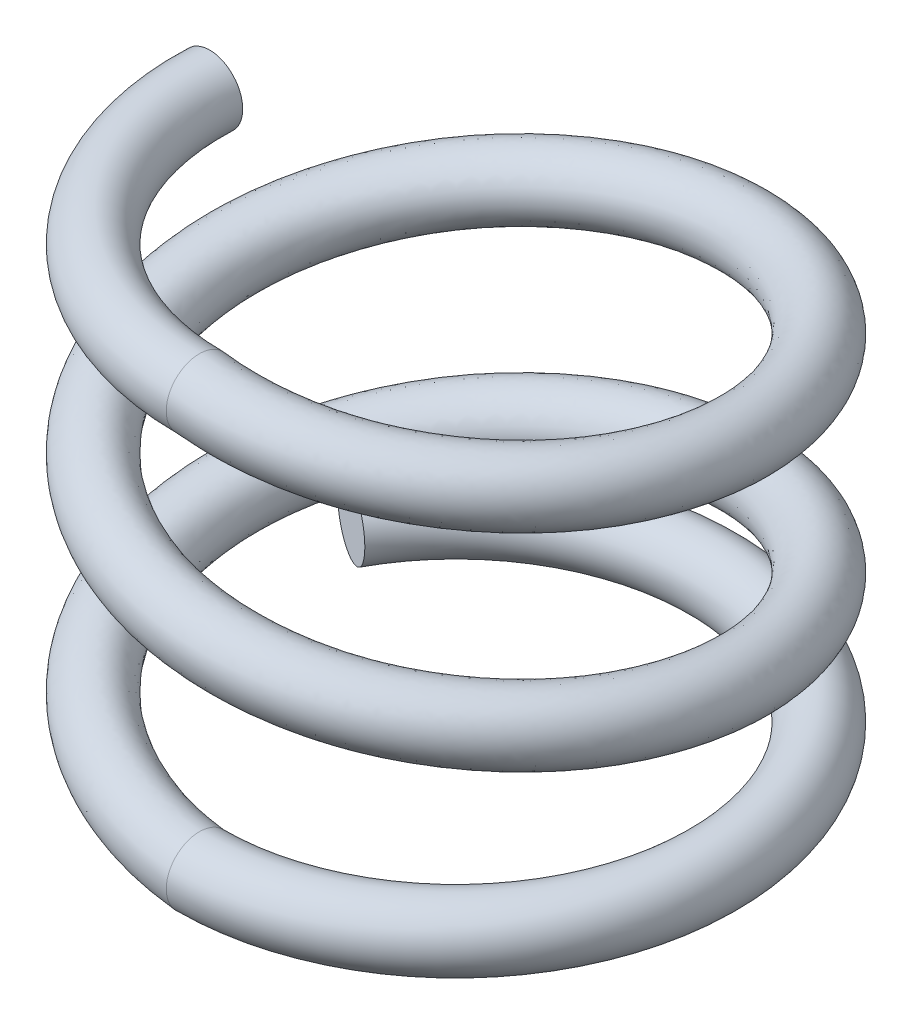
ISO-10303-21;
HEADER;
FILE_DESCRIPTION(('STEP AP214'),'2;1');
FILE_NAME('part.step','',(''),(''),'','','');
FILE_SCHEMA(('AUTOMOTIVE_DESIGN { 1 0 10303 214 1 1 1 1 }'));
ENDSEC;
DATA;
#1=APPLICATION_CONTEXT('core data for automotive mechanical design processes');
#2=APPLICATION_PROTOCOL_DEFINITION('international standard','automotive_design',2000,#1);
#3=PRODUCT_CONTEXT('',#1,'mechanical');
#4=PRODUCT('Part','Part','',(#3));
#5=PRODUCT_RELATED_PRODUCT_CATEGORY('part','',(#4));
#6=PRODUCT_DEFINITION_FORMATION('','',#4);
#7=PRODUCT_DEFINITION_CONTEXT('part definition',#1,'design');
#8=PRODUCT_DEFINITION('design','',#6,#7);
#9=PRODUCT_DEFINITION_SHAPE('','',#8);
#10=(LENGTH_UNIT() NAMED_UNIT(*) SI_UNIT(.MILLI.,.METRE.));
#11=(NAMED_UNIT(*) PLANE_ANGLE_UNIT() SI_UNIT($,.RADIAN.));
#12=(NAMED_UNIT(*) SI_UNIT($,.STERADIAN.) SOLID_ANGLE_UNIT());
#13=UNCERTAINTY_MEASURE_WITH_UNIT(LENGTH_MEASURE(1.E-05),#10,'distance_accuracy_value','');
#14=(GEOMETRIC_REPRESENTATION_CONTEXT(3) GLOBAL_UNCERTAINTY_ASSIGNED_CONTEXT((#13)) GLOBAL_UNIT_ASSIGNED_CONTEXT((#10,
#11,#12)) REPRESENTATION_CONTEXT('',''));
#15=CARTESIAN_POINT('',(0.,0.,0.));
#16=DIRECTION('',(0.,0.,1.));
#17=DIRECTION('',(1.,0.,0.));
#18=AXIS2_PLACEMENT_3D('',#15,#16,#17);
#19=CARTESIAN_POINT('',(0.,0.,2.7));
#20=CARTESIAN_POINT('',(-0.877283179828847,0.125,2.7));
#21=CARTESIAN_POINT('',(-1.58702018118968,0.25,2.18434588481236));
#22=CARTESIAN_POINT('',(-2.29675718255051,0.375,1.66869176962472));
#23=CARTESIAN_POINT('',(-2.56785259399691,0.5,0.834345884812358));
#24=CARTESIAN_POINT('',(-2.83894800544332,0.625,0.));
#25=CARTESIAN_POINT('',(-2.56785259399691,0.75,-0.834345884812358));
#26=CARTESIAN_POINT('',(-2.29675718255051,0.875,-1.66869176962472));
#27=CARTESIAN_POINT('',(-1.58702018118968,1.,-2.18434588481236));
#28=CARTESIAN_POINT('',(-0.877283179828847,1.125,-2.7));
#29=CARTESIAN_POINT('',(0.,1.25,-2.7));
#30=CARTESIAN_POINT('',(0.877283179828847,1.375,-2.7));
#31=CARTESIAN_POINT('',(1.58702018118968,1.5,-2.18434588481236));
#32=CARTESIAN_POINT('',(2.29675718255051,1.625,-1.66869176962472));
#33=CARTESIAN_POINT('',(2.56785259399691,1.75,-0.834345884812358));
#34=CARTESIAN_POINT('',(2.83894800544332,1.875,0.));
#35=CARTESIAN_POINT('',(2.56785259399691,2.,0.834345884812357));
#36=CARTESIAN_POINT('',(2.29675718255051,2.125,1.66869176962472));
#37=CARTESIAN_POINT('',(1.58702018118968,2.25,2.18434588481236));
#38=CARTESIAN_POINT('',(0.877283179828848,2.375,2.7));
#39=CARTESIAN_POINT('',(0.,2.5,2.7));
#40=CARTESIAN_POINT('',(-0.877283179828847,2.625,2.7));
#41=CARTESIAN_POINT('',(-1.58702018118968,2.75,2.18434588481236));
#42=CARTESIAN_POINT('',(-2.29675718255051,2.875,1.66869176962472));
#43=CARTESIAN_POINT('',(-2.56785259399691,3.,0.834345884812358));
#44=CARTESIAN_POINT('',(-2.83894800544332,3.125,0.));
#45=CARTESIAN_POINT('',(-2.56785259399691,3.25,-0.834345884812358));
#46=CARTESIAN_POINT('',(-2.29675718255051,3.375,-1.66869176962472));
#47=CARTESIAN_POINT('',(-1.58702018118968,3.5,-2.18434588481236));
#48=CARTESIAN_POINT('',(-0.877283179828847,3.625,-2.7));
#49=CARTESIAN_POINT('',(0.,3.75,-2.7));
#50=CARTESIAN_POINT('',(0.877283179828847,3.875,-2.7));
#51=CARTESIAN_POINT('',(1.58702018118968,4.,-2.18434588481236));
#52=CARTESIAN_POINT('',(2.29675718255051,4.125,-1.66869176962472));
#53=CARTESIAN_POINT('',(2.56785259399691,4.25,-0.834345884812358));
#54=CARTESIAN_POINT('',(2.83894800544332,4.375,0.));
#55=CARTESIAN_POINT('',(2.56785259399691,4.5,0.834345884812357));
#56=CARTESIAN_POINT('',(2.29675718255051,4.625,1.66869176962472));
#57=CARTESIAN_POINT('',(1.58702018118968,4.75,2.18434588481236));
#58=CARTESIAN_POINT('',(0.877283179828848,4.875,2.7));
#59=CARTESIAN_POINT('',(0.,5.,2.7));
#60=CARTESIAN_POINT('',(0.,0.800000000000001,2.7));
#61=CARTESIAN_POINT('',(-0.877283179828847,0.925000000000001,2.7));
#62=CARTESIAN_POINT('',(-1.58702018118968,1.05,2.18434588481236));
#63=CARTESIAN_POINT('',(-2.29675718255051,1.175,1.66869176962472));
#64=CARTESIAN_POINT('',(-2.56785259399691,1.3,0.834345884812358));
#65=CARTESIAN_POINT('',(-2.83894800544332,1.425,0.));
#66=CARTESIAN_POINT('',(-2.56785259399691,1.55,-0.834345884812358));
#67=CARTESIAN_POINT('',(-2.29675718255051,1.675,-1.66869176962472));
#68=CARTESIAN_POINT('',(-1.58702018118968,1.8,-2.18434588481236));
#69=CARTESIAN_POINT('',(-0.877283179828847,1.925,-2.7));
#70=CARTESIAN_POINT('',(0.,2.05,-2.7));
#71=CARTESIAN_POINT('',(0.877283179828847,2.175,-2.7));
#72=CARTESIAN_POINT('',(1.58702018118968,2.3,-2.18434588481236));
#73=CARTESIAN_POINT('',(2.29675718255051,2.425,-1.66869176962472));
#74=CARTESIAN_POINT('',(2.56785259399691,2.55,-0.834345884812358));
#75=CARTESIAN_POINT('',(2.83894800544332,2.675,0.));
#76=CARTESIAN_POINT('',(2.56785259399691,2.8,0.834345884812357));
#77=CARTESIAN_POINT('',(2.29675718255051,2.925,1.66869176962472));
#78=CARTESIAN_POINT('',(1.58702018118968,3.05,2.18434588481236));
#79=CARTESIAN_POINT('',(0.877283179828848,3.175,2.7));
#80=CARTESIAN_POINT('',(0.,3.3,2.7));
#81=CARTESIAN_POINT('',(-0.877283179828847,3.425,2.7));
#82=CARTESIAN_POINT('',(-1.58702018118968,3.55,2.18434588481236));
#83=CARTESIAN_POINT('',(-2.29675718255051,3.675,1.66869176962472));
#84=CARTESIAN_POINT('',(-2.56785259399691,3.8,0.834345884812358));
#85=CARTESIAN_POINT('',(-2.83894800544332,3.925,0.));
#86=CARTESIAN_POINT('',(-2.56785259399691,4.05,-0.834345884812358));
#87=CARTESIAN_POINT('',(-2.29675718255051,4.175,-1.66869176962472));
#88=CARTESIAN_POINT('',(-1.58702018118968,4.3,-2.18434588481236));
#89=CARTESIAN_POINT('',(-0.877283179828847,4.425,-2.7));
#90=CARTESIAN_POINT('',(0.,4.55,-2.7));
#91=CARTESIAN_POINT('',(0.877283179828847,4.675,-2.7));
#92=CARTESIAN_POINT('',(1.58702018118968,4.8,-2.18434588481236));
#93=CARTESIAN_POINT('',(2.29675718255051,4.925,-1.66869176962472));
#94=CARTESIAN_POINT('',(2.56785259399691,5.05,-0.834345884812358));
#95=CARTESIAN_POINT('',(2.83894800544332,5.175,0.));
#96=CARTESIAN_POINT('',(2.56785259399691,5.3,0.834345884812357));
#97=CARTESIAN_POINT('',(2.29675718255051,5.425,1.66869176962472));
#98=CARTESIAN_POINT('',(1.58702018118968,5.55,2.18434588481236));
#99=CARTESIAN_POINT('',(0.877283179828848,5.675,2.7));
#100=CARTESIAN_POINT('',(0.,5.8,2.7));
#101=CARTESIAN_POINT('',(0.,0.800000000000001,3.5));
#102=CARTESIAN_POINT('',(-1.13721893681517,0.925000000000001,3.5));
#103=CARTESIAN_POINT('',(-2.05724838302366,1.05,2.83155948031232));
#104=CARTESIAN_POINT('',(-2.97727782923214,1.175,2.16311896062463));
#105=CARTESIAN_POINT('',(-3.32869780703304,1.3,1.08155948031232));
#106=CARTESIAN_POINT('',(-3.68011778483394,1.425,0.));
#107=CARTESIAN_POINT('',(-3.32869780703304,1.55,-1.08155948031232));
#108=CARTESIAN_POINT('',(-2.97727782923214,1.675,-2.16311896062463));
#109=CARTESIAN_POINT('',(-2.05724838302366,1.8,-2.83155948031232));
#110=CARTESIAN_POINT('',(-1.13721893681517,1.925,-3.5));
#111=CARTESIAN_POINT('',(0.,2.05,-3.5));
#112=CARTESIAN_POINT('',(1.13721893681517,2.175,-3.5));
#113=CARTESIAN_POINT('',(2.05724838302366,2.3,-2.83155948031232));
#114=CARTESIAN_POINT('',(2.97727782923214,2.425,-2.16311896062463));
#115=CARTESIAN_POINT('',(3.32869780703304,2.55,-1.08155948031232));
#116=CARTESIAN_POINT('',(3.68011778483394,2.675,0.));
#117=CARTESIAN_POINT('',(3.32869780703304,2.8,1.08155948031232));
#118=CARTESIAN_POINT('',(2.97727782923214,2.925,2.16311896062463));
#119=CARTESIAN_POINT('',(2.05724838302366,3.05,2.83155948031232));
#120=CARTESIAN_POINT('',(1.13721893681517,3.175,3.5));
#121=CARTESIAN_POINT('',(0.,3.3,3.5));
#122=CARTESIAN_POINT('',(-1.13721893681517,3.425,3.5));
#123=CARTESIAN_POINT('',(-2.05724838302366,3.55,2.83155948031232));
#124=CARTESIAN_POINT('',(-2.97727782923214,3.675,2.16311896062463));
#125=CARTESIAN_POINT('',(-3.32869780703304,3.8,1.08155948031232));
#126=CARTESIAN_POINT('',(-3.68011778483394,3.925,0.));
#127=CARTESIAN_POINT('',(-3.32869780703304,4.05,-1.08155948031232));
#128=CARTESIAN_POINT('',(-2.97727782923214,4.175,-2.16311896062463));
#129=CARTESIAN_POINT('',(-2.05724838302366,4.3,-2.83155948031232));
#130=CARTESIAN_POINT('',(-1.13721893681517,4.425,-3.5));
#131=CARTESIAN_POINT('',(0.,4.55,-3.5));
#132=CARTESIAN_POINT('',(1.13721893681517,4.675,-3.5));
#133=CARTESIAN_POINT('',(2.05724838302366,4.8,-2.83155948031232));
#134=CARTESIAN_POINT('',(2.97727782923214,4.925,-2.16311896062463));
#135=CARTESIAN_POINT('',(3.32869780703304,5.05,-1.08155948031232));
#136=CARTESIAN_POINT('',(3.68011778483394,5.175,0.));
#137=CARTESIAN_POINT('',(3.32869780703304,5.3,1.08155948031232));
#138=CARTESIAN_POINT('',(2.97727782923214,5.425,2.16311896062463));
#139=CARTESIAN_POINT('',(2.05724838302366,5.55,2.83155948031232));
#140=CARTESIAN_POINT('',(1.13721893681517,5.675,3.5));
#141=CARTESIAN_POINT('',(0.,5.8,3.5));
#142=CARTESIAN_POINT('',(0.,0.,3.5));
#143=CARTESIAN_POINT('',(-1.13721893681517,0.125,3.5));
#144=CARTESIAN_POINT('',(-2.05724838302366,0.25,2.83155948031232));
#145=CARTESIAN_POINT('',(-2.97727782923214,0.375,2.16311896062463));
#146=CARTESIAN_POINT('',(-3.32869780703304,0.5,1.08155948031232));
#147=CARTESIAN_POINT('',(-3.68011778483394,0.625,0.));
#148=CARTESIAN_POINT('',(-3.32869780703304,0.75,-1.08155948031232));
#149=CARTESIAN_POINT('',(-2.97727782923214,0.875,-2.16311896062463));
#150=CARTESIAN_POINT('',(-2.05724838302366,1.,-2.83155948031232));
#151=CARTESIAN_POINT('',(-1.13721893681517,1.125,-3.5));
#152=CARTESIAN_POINT('',(0.,1.25,-3.5));
#153=CARTESIAN_POINT('',(1.13721893681517,1.375,-3.5));
#154=CARTESIAN_POINT('',(2.05724838302366,1.5,-2.83155948031232));
#155=CARTESIAN_POINT('',(2.97727782923214,1.625,-2.16311896062463));
#156=CARTESIAN_POINT('',(3.32869780703304,1.75,-1.08155948031232));
#157=CARTESIAN_POINT('',(3.68011778483394,1.875,0.));
#158=CARTESIAN_POINT('',(3.32869780703304,2.,1.08155948031232));
#159=CARTESIAN_POINT('',(2.97727782923214,2.125,2.16311896062463));
#160=CARTESIAN_POINT('',(2.05724838302366,2.25,2.83155948031232));
#161=CARTESIAN_POINT('',(1.13721893681517,2.375,3.5));
#162=CARTESIAN_POINT('',(0.,2.5,3.5));
#163=CARTESIAN_POINT('',(-1.13721893681517,2.625,3.5));
#164=CARTESIAN_POINT('',(-2.05724838302366,2.75,2.83155948031232));
#165=CARTESIAN_POINT('',(-2.97727782923214,2.875,2.16311896062463));
#166=CARTESIAN_POINT('',(-3.32869780703304,3.,1.08155948031232));
#167=CARTESIAN_POINT('',(-3.68011778483394,3.125,0.));
#168=CARTESIAN_POINT('',(-3.32869780703304,3.25,-1.08155948031232));
#169=CARTESIAN_POINT('',(-2.97727782923214,3.375,-2.16311896062463));
#170=CARTESIAN_POINT('',(-2.05724838302366,3.5,-2.83155948031232));
#171=CARTESIAN_POINT('',(-1.13721893681517,3.625,-3.5));
#172=CARTESIAN_POINT('',(0.,3.75,-3.5));
#173=CARTESIAN_POINT('',(1.13721893681517,3.875,-3.5));
#174=CARTESIAN_POINT('',(2.05724838302366,4.,-2.83155948031232));
#175=CARTESIAN_POINT('',(2.97727782923214,4.125,-2.16311896062463));
#176=CARTESIAN_POINT('',(3.32869780703304,4.25,-1.08155948031232));
#177=CARTESIAN_POINT('',(3.68011778483394,4.375,0.));
#178=CARTESIAN_POINT('',(3.32869780703304,4.5,1.08155948031232));
#179=CARTESIAN_POINT('',(2.97727782923214,4.625,2.16311896062463));
#180=CARTESIAN_POINT('',(2.05724838302366,4.75,2.83155948031232));
#181=CARTESIAN_POINT('',(1.13721893681517,4.875,3.5));
#182=CARTESIAN_POINT('',(0.,5.,3.5));
#183=CARTESIAN_POINT('',(0.,-0.800000000000001,3.5));
#184=CARTESIAN_POINT('',(-1.13721893681517,-0.675000000000001,3.5));
#185=CARTESIAN_POINT('',(-2.05724838302366,-0.550000000000001,2.83155948031232));
#186=CARTESIAN_POINT('',(-2.97727782923214,-0.425000000000001,2.16311896062463));
#187=CARTESIAN_POINT('',(-3.32869780703304,-0.300000000000001,1.08155948031232));
#188=CARTESIAN_POINT('',(-3.68011778483394,-0.175000000000001,0.));
#189=CARTESIAN_POINT('',(-3.32869780703304,-0.0500000000000008,-1.08155948031232));
#190=CARTESIAN_POINT('',(-2.97727782923214,0.0749999999999992,-2.16311896062463));
#191=CARTESIAN_POINT('',(-2.05724838302366,0.199999999999999,-2.83155948031232));
#192=CARTESIAN_POINT('',(-1.13721893681517,0.324999999999999,-3.5));
#193=CARTESIAN_POINT('',(0.,0.449999999999999,-3.5));
#194=CARTESIAN_POINT('',(1.13721893681517,0.574999999999999,-3.5));
#195=CARTESIAN_POINT('',(2.05724838302366,0.699999999999999,-2.83155948031232));
#196=CARTESIAN_POINT('',(2.97727782923214,0.824999999999999,-2.16311896062463));
#197=CARTESIAN_POINT('',(3.32869780703304,0.949999999999999,-1.08155948031232));
#198=CARTESIAN_POINT('',(3.68011778483394,1.075,0.));
#199=CARTESIAN_POINT('',(3.32869780703304,1.2,1.08155948031232));
#200=CARTESIAN_POINT('',(2.97727782923214,1.325,2.16311896062463));
#201=CARTESIAN_POINT('',(2.05724838302366,1.45,2.83155948031232));
#202=CARTESIAN_POINT('',(1.13721893681517,1.575,3.5));
#203=CARTESIAN_POINT('',(0.,1.7,3.5));
#204=CARTESIAN_POINT('',(-1.13721893681517,1.825,3.5));
#205=CARTESIAN_POINT('',(-2.05724838302366,1.95,2.83155948031232));
#206=CARTESIAN_POINT('',(-2.97727782923214,2.075,2.16311896062463));
#207=CARTESIAN_POINT('',(-3.32869780703304,2.2,1.08155948031232));
#208=CARTESIAN_POINT('',(-3.68011778483394,2.325,0.));
#209=CARTESIAN_POINT('',(-3.32869780703304,2.45,-1.08155948031232));
#210=CARTESIAN_POINT('',(-2.97727782923214,2.575,-2.16311896062463));
#211=CARTESIAN_POINT('',(-2.05724838302366,2.7,-2.83155948031232));
#212=CARTESIAN_POINT('',(-1.13721893681517,2.825,-3.5));
#213=CARTESIAN_POINT('',(0.,2.95,-3.5));
#214=CARTESIAN_POINT('',(1.13721893681517,3.075,-3.5));
#215=CARTESIAN_POINT('',(2.05724838302366,3.2,-2.83155948031232));
#216=CARTESIAN_POINT('',(2.97727782923214,3.325,-2.16311896062463));
#217=CARTESIAN_POINT('',(3.32869780703304,3.45,-1.08155948031232));
#218=CARTESIAN_POINT('',(3.68011778483394,3.575,0.));
#219=CARTESIAN_POINT('',(3.32869780703304,3.7,1.08155948031232));
#220=CARTESIAN_POINT('',(2.97727782923214,3.825,2.16311896062463));
#221=CARTESIAN_POINT('',(2.05724838302366,3.95,2.83155948031232));
#222=CARTESIAN_POINT('',(1.13721893681517,4.075,3.5));
#223=CARTESIAN_POINT('',(0.,4.2,3.5));
#224=CARTESIAN_POINT('',(0.,-0.800000000000001,2.7));
#225=CARTESIAN_POINT('',(-0.877283179828847,-0.675000000000001,2.7));
#226=CARTESIAN_POINT('',(-1.58702018118968,-0.550000000000001,2.18434588481236));
#227=CARTESIAN_POINT('',(-2.29675718255051,-0.425000000000001,1.66869176962472));
#228=CARTESIAN_POINT('',(-2.56785259399691,-0.300000000000001,0.834345884812358));
#229=CARTESIAN_POINT('',(-2.83894800544332,-0.175000000000001,0.));
#230=CARTESIAN_POINT('',(-2.56785259399691,-0.0500000000000008,-0.834345884812358));
#231=CARTESIAN_POINT('',(-2.29675718255051,0.0749999999999992,-1.66869176962472));
#232=CARTESIAN_POINT('',(-1.58702018118968,0.199999999999999,-2.18434588481236));
#233=CARTESIAN_POINT('',(-0.877283179828847,0.324999999999999,-2.7));
#234=CARTESIAN_POINT('',(0.,0.449999999999999,-2.7));
#235=CARTESIAN_POINT('',(0.877283179828847,0.574999999999999,-2.7));
#236=CARTESIAN_POINT('',(1.58702018118968,0.699999999999999,-2.18434588481236));
#237=CARTESIAN_POINT('',(2.29675718255051,0.824999999999999,-1.66869176962472));
#238=CARTESIAN_POINT('',(2.56785259399691,0.949999999999999,-0.834345884812358));
#239=CARTESIAN_POINT('',(2.83894800544332,1.075,0.));
#240=CARTESIAN_POINT('',(2.56785259399691,1.2,0.834345884812357));
#241=CARTESIAN_POINT('',(2.29675718255051,1.325,1.66869176962472));
#242=CARTESIAN_POINT('',(1.58702018118968,1.45,2.18434588481236));
#243=CARTESIAN_POINT('',(0.877283179828848,1.575,2.7));
#244=CARTESIAN_POINT('',(0.,1.7,2.7));
#245=CARTESIAN_POINT('',(-0.877283179828847,1.825,2.7));
#246=CARTESIAN_POINT('',(-1.58702018118968,1.95,2.18434588481236));
#247=CARTESIAN_POINT('',(-2.29675718255051,2.075,1.66869176962472));
#248=CARTESIAN_POINT('',(-2.56785259399691,2.2,0.834345884812358));
#249=CARTESIAN_POINT('',(-2.83894800544332,2.325,0.));
#250=CARTESIAN_POINT('',(-2.56785259399691,2.45,-0.834345884812358));
#251=CARTESIAN_POINT('',(-2.29675718255051,2.575,-1.66869176962472));
#252=CARTESIAN_POINT('',(-1.58702018118968,2.7,-2.18434588481236));
#253=CARTESIAN_POINT('',(-0.877283179828847,2.825,-2.7));
#254=CARTESIAN_POINT('',(0.,2.95,-2.7));
#255=CARTESIAN_POINT('',(0.877283179828847,3.075,-2.7));
#256=CARTESIAN_POINT('',(1.58702018118968,3.2,-2.18434588481236));
#257=CARTESIAN_POINT('',(2.29675718255051,3.325,-1.66869176962472));
#258=CARTESIAN_POINT('',(2.56785259399691,3.45,-0.834345884812358));
#259=CARTESIAN_POINT('',(2.83894800544332,3.575,0.));
#260=CARTESIAN_POINT('',(2.56785259399691,3.7,0.834345884812357));
#261=CARTESIAN_POINT('',(2.29675718255051,3.825,1.66869176962472));
#262=CARTESIAN_POINT('',(1.58702018118968,3.95,2.18434588481236));
#263=CARTESIAN_POINT('',(0.877283179828848,4.075,2.7));
#264=CARTESIAN_POINT('',(0.,4.2,2.7));
#265=CARTESIAN_POINT('',(0.,0.,2.7));
#266=CARTESIAN_POINT('',(-0.877283179828847,0.125,2.7));
#267=CARTESIAN_POINT('',(-1.58702018118968,0.25,2.18434588481236));
#268=CARTESIAN_POINT('',(-2.29675718255051,0.375,1.66869176962472));
#269=CARTESIAN_POINT('',(-2.56785259399691,0.5,0.834345884812358));
#270=CARTESIAN_POINT('',(-2.83894800544332,0.625,0.));
#271=CARTESIAN_POINT('',(-2.56785259399691,0.75,-0.834345884812358));
#272=CARTESIAN_POINT('',(-2.29675718255051,0.875,-1.66869176962472));
#273=CARTESIAN_POINT('',(-1.58702018118968,1.,-2.18434588481236));
#274=CARTESIAN_POINT('',(-0.877283179828847,1.125,-2.7));
#275=CARTESIAN_POINT('',(0.,1.25,-2.7));
#276=CARTESIAN_POINT('',(0.877283179828847,1.375,-2.7));
#277=CARTESIAN_POINT('',(1.58702018118968,1.5,-2.18434588481236));
#278=CARTESIAN_POINT('',(2.29675718255051,1.625,-1.66869176962472));
#279=CARTESIAN_POINT('',(2.56785259399691,1.75,-0.834345884812358));
#280=CARTESIAN_POINT('',(2.83894800544332,1.875,0.));
#281=CARTESIAN_POINT('',(2.56785259399691,2.,0.834345884812357));
#282=CARTESIAN_POINT('',(2.29675718255051,2.125,1.66869176962472));
#283=CARTESIAN_POINT('',(1.58702018118968,2.25,2.18434588481236));
#284=CARTESIAN_POINT('',(0.877283179828848,2.375,2.7));
#285=CARTESIAN_POINT('',(0.,2.5,2.7));
#286=CARTESIAN_POINT('',(-0.877283179828847,2.625,2.7));
#287=CARTESIAN_POINT('',(-1.58702018118968,2.75,2.18434588481236));
#288=CARTESIAN_POINT('',(-2.29675718255051,2.875,1.66869176962472));
#289=CARTESIAN_POINT('',(-2.56785259399691,3.,0.834345884812358));
#290=CARTESIAN_POINT('',(-2.83894800544332,3.125,0.));
#291=CARTESIAN_POINT('',(-2.56785259399691,3.25,-0.834345884812358));
#292=CARTESIAN_POINT('',(-2.29675718255051,3.375,-1.66869176962472));
#293=CARTESIAN_POINT('',(-1.58702018118968,3.5,-2.18434588481236));
#294=CARTESIAN_POINT('',(-0.877283179828847,3.625,-2.7));
#295=CARTESIAN_POINT('',(0.,3.75,-2.7));
#296=CARTESIAN_POINT('',(0.877283179828847,3.875,-2.7));
#297=CARTESIAN_POINT('',(1.58702018118968,4.,-2.18434588481236));
#298=CARTESIAN_POINT('',(2.29675718255051,4.125,-1.66869176962472));
#299=CARTESIAN_POINT('',(2.56785259399691,4.25,-0.834345884812358));
#300=CARTESIAN_POINT('',(2.83894800544332,4.375,0.));
#301=CARTESIAN_POINT('',(2.56785259399691,4.5,0.834345884812357));
#302=CARTESIAN_POINT('',(2.29675718255051,4.625,1.66869176962472));
#303=CARTESIAN_POINT('',(1.58702018118968,4.75,2.18434588481236));
#304=CARTESIAN_POINT('',(0.877283179828848,4.875,2.7));
#305=CARTESIAN_POINT('',(0.,5.,2.7));
#306=(BOUNDED_SURFACE() B_SPLINE_SURFACE(3,2,((#19,#20,#21,#22,#23,#24,#25,#26,#27,#28,#29,#30,
#31,#32,#33,#34,#35,#36,#37,#38,#39,#40,#41,#42,#43,#44,#45,#46,#47,#48,#49,#50,#51,#52,#53,#54,
#55,#56,#57,#58,#59),(#60,#61,#62,#63,#64,#65,#66,#67,#68,#69,#70,#71,#72,#73,#74,#75,#76,#77,
#78,#79,#80,#81,#82,#83,#84,#85,#86,#87,#88,#89,#90,#91,#92,#93,#94,#95,#96,#97,#98,#99,#100),
(#101,#102,#103,#104,#105,#106,#107,#108,#109,#110,#111,#112,#113,#114,#115,#116,#117,#118,#119,
#120,#121,#122,#123,#124,#125,#126,#127,#128,#129,#130,#131,#132,#133,#134,#135,#136,#137,#138,
#139,#140,#141),(#142,#143,#144,#145,#146,#147,#148,#149,#150,#151,#152,#153,#154,#155,#156,
#157,#158,#159,#160,#161,#162,#163,#164,#165,#166,#167,#168,#169,#170,#171,#172,#173,#174,#175,
#176,#177,#178,#179,#180,#181,#182),(#183,#184,#185,#186,#187,#188,#189,#190,#191,#192,#193,
#194,#195,#196,#197,#198,#199,#200,#201,#202,#203,#204,#205,#206,#207,#208,#209,#210,#211,#212,
#213,#214,#215,#216,#217,#218,#219,#220,#221,#222,#223),(#224,#225,#226,#227,#228,#229,#230,
#231,#232,#233,#234,#235,#236,#237,#238,#239,#240,#241,#242,#243,#244,#245,#246,#247,#248,#249,
#250,#251,#252,#253,#254,#255,#256,#257,#258,#259,#260,#261,#262,#263,#264),(#265,#266,#267,
#268,#269,#270,#271,#272,#273,#274,#275,#276,#277,#278,#279,#280,#281,#282,#283,#284,#285,#286,
#287,#288,#289,#290,#291,#292,#293,#294,#295,#296,#297,#298,#299,#300,#301,#302,#303,#304,
#305)),.UNSPECIFIED.,.T.,.F.,.F.) B_SPLINE_SURFACE_WITH_KNOTS((4,3,4),(3,2,2,2,2,2,2,2,2,2,2,2,
2,2,2,2,2,2,2,2,3),(0.,0.5,1.),(0.,0.05,0.1,0.15,0.2,0.25,0.3,0.35,0.4,0.45,0.5,0.55,0.6,0.65,
0.7,0.75,0.8,0.85,0.9,0.95,1.),
.UNSPECIFIED.) GEOMETRIC_REPRESENTATION_ITEM() RATIONAL_B_SPLINE_SURFACE(((1.,0.951056516295154,
1.,0.951056516295154,1.,0.951056516295154,1.,0.951056516295154,1.,0.951056516295154,1.,
0.951056516295154,1.,0.951056516295154,1.,0.951056516295154,1.,0.951056516295154,1.,
0.951056516295154,1.,0.951056516295154,1.,0.951056516295154,1.,0.951056516295154,1.,
0.951056516295154,1.,0.951056516295154,1.,0.951056516295154,1.,0.951056516295154,1.,
0.951056516295154,1.,0.951056516295154,1.,0.951056516295154,1.),(0.333333333333333,
0.317018838765051,0.333333333333333,0.317018838765051,0.333333333333333,0.317018838765051,
0.333333333333333,0.317018838765051,0.333333333333333,0.317018838765051,0.333333333333333,
0.317018838765051,0.333333333333333,0.317018838765051,0.333333333333333,0.317018838765051,
0.333333333333333,0.317018838765051,0.333333333333333,0.317018838765051,0.333333333333333,
0.317018838765051,0.333333333333333,0.317018838765051,0.333333333333333,0.317018838765051,
0.333333333333333,0.317018838765051,0.333333333333333,0.317018838765051,0.333333333333333,
0.317018838765051,0.333333333333333,0.317018838765051,0.333333333333333,0.317018838765051,
0.333333333333333,0.317018838765051,0.333333333333333,0.317018838765051,0.333333333333333),
(0.333333333333333,0.317018838765051,0.333333333333333,0.317018838765051,0.333333333333333,
0.317018838765051,0.333333333333333,0.317018838765051,0.333333333333333,0.317018838765051,
0.333333333333333,0.317018838765051,0.333333333333333,0.317018838765051,0.333333333333333,
0.317018838765051,0.333333333333333,0.317018838765051,0.333333333333333,0.317018838765051,
0.333333333333333,0.317018838765051,0.333333333333333,0.317018838765051,0.333333333333333,
0.317018838765051,0.333333333333333,0.317018838765051,0.333333333333333,0.317018838765051,
0.333333333333333,0.317018838765051,0.333333333333333,0.317018838765051,0.333333333333333,
0.317018838765051,0.333333333333333,0.317018838765051,0.333333333333333,0.317018838765051,
0.333333333333333),(1.,0.951056516295154,1.,0.951056516295154,1.,0.951056516295154,1.,
0.951056516295154,1.,0.951056516295154,1.,0.951056516295154,1.,0.951056516295154,1.,
0.951056516295154,1.,0.951056516295154,1.,0.951056516295154,1.,0.951056516295154,1.,
0.951056516295154,1.,0.951056516295154,1.,0.951056516295154,1.,0.951056516295154,1.,
0.951056516295154,1.,0.951056516295154,1.,0.951056516295154,1.,0.951056516295154,1.,
0.951056516295154,1.),(0.333333333333333,0.317018838765051,0.333333333333333,0.317018838765051,
0.333333333333333,0.317018838765051,0.333333333333333,0.317018838765051,0.333333333333333,
0.317018838765051,0.333333333333333,0.317018838765051,0.333333333333333,0.317018838765051,
0.333333333333333,0.317018838765051,0.333333333333333,0.317018838765051,0.333333333333333,
0.317018838765051,0.333333333333333,0.317018838765051,0.333333333333333,0.317018838765051,
0.333333333333333,0.317018838765051,0.333333333333333,0.317018838765051,0.333333333333333,
0.317018838765051,0.333333333333333,0.317018838765051,0.333333333333333,0.317018838765051,
0.333333333333333,0.317018838765051,0.333333333333333,0.317018838765051,0.333333333333333,
0.317018838765051,0.333333333333333),(0.333333333333333,0.317018838765051,0.333333333333333,
0.317018838765051,0.333333333333333,0.317018838765051,0.333333333333333,0.317018838765051,
0.333333333333333,0.317018838765051,0.333333333333333,0.317018838765051,0.333333333333333,
0.317018838765051,0.333333333333333,0.317018838765051,0.333333333333333,0.317018838765051,
0.333333333333333,0.317018838765051,0.333333333333333,0.317018838765051,0.333333333333333,
0.317018838765051,0.333333333333333,0.317018838765051,0.333333333333333,0.317018838765051,
0.333333333333333,0.317018838765051,0.333333333333333,0.317018838765051,0.333333333333333,
0.317018838765051,0.333333333333333,0.317018838765051,0.333333333333333,0.317018838765051,
0.333333333333333,0.317018838765051,0.333333333333333),(1.,0.951056516295154,1.,
0.951056516295154,1.,0.951056516295154,1.,0.951056516295154,1.,0.951056516295154,1.,
0.951056516295154,1.,0.951056516295154,1.,0.951056516295154,1.,0.951056516295154,1.,
0.951056516295154,1.,0.951056516295154,1.,0.951056516295154,1.,0.951056516295154,1.,
0.951056516295154,1.,0.951056516295154,1.,0.951056516295154,1.,0.951056516295154,1.,
0.951056516295154,1.,0.951056516295154,1.,0.951056516295154,1.))) REPRESENTATION_ITEM('') SURFACE());
#307=CARTESIAN_POINT('',(0.,0.,3.1));
#308=DIRECTION('',(1.,0.,0.));
#309=DIRECTION('',(0.,0.,-1.));
#310=AXIS2_PLACEMENT_3D('',#307,#308,#309);
#311=CIRCLE('',#310,0.400000000000001);
#312=CARTESIAN_POINT('',(0.,0.,3.5));
#313=VERTEX_POINT('',#312);
#314=EDGE_CURVE('E46',#313,#313,#311,.T.);
#315=CARTESIAN_POINT('',(0.,5.,3.1));
#316=DIRECTION('',(-1.,0.,0.));
#317=DIRECTION('',(0.,0.,-1.));
#318=AXIS2_PLACEMENT_3D('',#315,#316,#317);
#319=CIRCLE('',#318,0.400000000000001);
#320=CARTESIAN_POINT('',(0.,5.,3.5));
#321=VERTEX_POINT('',#320);
#322=EDGE_CURVE('E10',#321,#321,#319,.T.);
#323=ORIENTED_EDGE('',*,*,#314,.F.);
#324=EDGE_LOOP('',(#323));
#325=FACE_BOUND('',#324,.T.);
#326=ORIENTED_EDGE('',*,*,#322,.F.);
#327=EDGE_LOOP('',(#326));
#328=FACE_BOUND('',#327,.T.);
#329=ADVANCED_FACE('F41',(#325,#328),#306,.F.);
#330=CARTESIAN_POINT('',(-2.73136784864909,0.,-1.46616154477126));
#331=DIRECTION('',(-0.472955337022988,0.,0.881086402790028));
#332=DIRECTION('',(0.881086402790028,0.,0.472955337022988));
#333=AXIS2_PLACEMENT_3D('',#330,#331,#332);
#334=PLANE('',#333);
#335=CARTESIAN_POINT('',(-2.73136784864909,0.,-1.46616154477126));
#336=DIRECTION('',(-0.472955337022988,0.,0.881086402790028));
#337=DIRECTION('',(0.881086402790028,0.,0.472955337022988));
#338=AXIS2_PLACEMENT_3D('',#335,#336,#337);
#339=CIRCLE('',#338,0.4);
#340=CARTESIAN_POINT('',(-3.0838024097651,0.,-1.65534367958046));
#341=VERTEX_POINT('',#340);
#342=EDGE_CURVE('E52',#341,#341,#339,.T.);
#343=ORIENTED_EDGE('',*,*,#342,.T.);
#344=EDGE_LOOP('',(#343));
#345=FACE_BOUND('',#344,.T.);
#346=ADVANCED_FACE('F69',(#345),#334,.T.);
#347=CARTESIAN_POINT('',(0.,0.,0.));
#348=DIRECTION('',(0.,1.,0.));
#349=DIRECTION('',(0.,0.,1.));
#350=AXIS2_PLACEMENT_3D('',#347,#348,#349);
#351=TOROIDAL_SURFACE('',#350,3.1,0.4);
#352=CARTESIAN_POINT('',(0.,0.,0.));
#353=DIRECTION('',(0.,1.,0.));
#354=DIRECTION('',(0.,0.,1.));
#355=AXIS2_PLACEMENT_3D('',#352,#353,#354);
#356=CIRCLE('',#355,3.5);
#357=EDGE_CURVE('',#313,#341,#356,.T.);
#358=ORIENTED_EDGE('',*,*,#314,.T.);
#359=ORIENTED_EDGE('',*,*,#342,.F.);
#360=ORIENTED_EDGE('',*,*,#357,.T.);
#361=ORIENTED_EDGE('',*,*,#357,.F.);
#362=EDGE_LOOP('',(#358,#360,#359,#361));
#363=FACE_BOUND('',#362,.T.);
#364=ADVANCED_FACE('F67',(#363),#351,.T.);
#365=CARTESIAN_POINT('',(-3.09689047643528,5.,-0.13881418142429));
#366=DIRECTION('',(0.0447787682013837,0.,-0.998996927882347));
#367=DIRECTION('',(-0.998996927882347,0.,-0.0447787682013837));
#368=AXIS2_PLACEMENT_3D('',#365,#366,#367);
#369=PLANE('',#368);
#370=CARTESIAN_POINT('',(-3.09689047643528,5.,-0.13881418142429));
#371=DIRECTION('',(0.0447787682013837,0.,-0.998996927882347));
#372=DIRECTION('',(-0.998996927882347,0.,-0.0447787682013837));
#373=AXIS2_PLACEMENT_3D('',#370,#371,#372);
#374=CIRCLE('',#373,0.4);
#375=CARTESIAN_POINT('',(-3.49648924758821,5.,-0.156725688704843));
#376=VERTEX_POINT('',#375);
#377=EDGE_CURVE('E60',#376,#376,#374,.T.);
#378=ORIENTED_EDGE('',*,*,#377,.T.);
#379=EDGE_LOOP('',(#378));
#380=FACE_BOUND('',#379,.T.);
#381=ADVANCED_FACE('F64',(#380),#369,.T.);
#382=CARTESIAN_POINT('',(0.,5.,0.));
#383=DIRECTION('',(0.,-1.,0.));
#384=DIRECTION('',(0.,0.,-1.));
#385=AXIS2_PLACEMENT_3D('',#382,#383,#384);
#386=TOROIDAL_SURFACE('',#385,3.1,0.4);
#387=CARTESIAN_POINT('',(0.,5.,0.));
#388=DIRECTION('',(0.,-1.,0.));
#389=DIRECTION('',(0.,0.,-1.));
#390=AXIS2_PLACEMENT_3D('',#387,#388,#389);
#391=CIRCLE('',#390,3.5);
#392=EDGE_CURVE('',#321,#376,#391,.T.);
#393=ORIENTED_EDGE('',*,*,#322,.T.);
#394=ORIENTED_EDGE('',*,*,#377,.F.);
#395=ORIENTED_EDGE('',*,*,#392,.T.);
#396=ORIENTED_EDGE('',*,*,#392,.F.);
#397=EDGE_LOOP('',(#393,#395,#394,#396));
#398=FACE_BOUND('',#397,.T.);
#399=ADVANCED_FACE('F65',(#398),#386,.T.);
#400=CLOSED_SHELL('',(#329,#346,#364,#381,#399));
#401=MANIFOLD_SOLID_BREP('B2',#400);
#402=ADVANCED_BREP_SHAPE_REPRESENTATION('',(#18,#401),#14);
#403=SHAPE_DEFINITION_REPRESENTATION(#9,#402);
ENDSEC;
END-ISO-10303-21;
